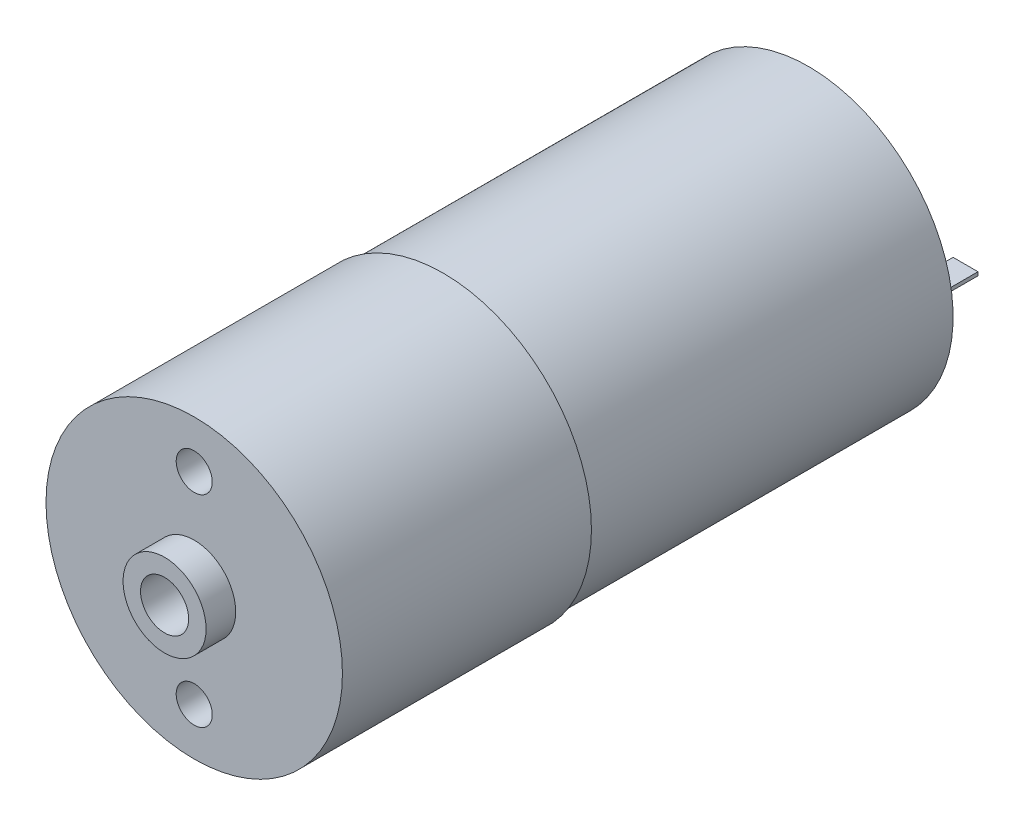
ISO-10303-21;
HEADER;
FILE_DESCRIPTION(('STEP AP214'),'2;1');
FILE_NAME('part.step','',(''),(''),'','','');
FILE_SCHEMA(('AUTOMOTIVE_DESIGN { 1 0 10303 214 1 1 1 1 }'));
ENDSEC;
DATA;
#1=APPLICATION_CONTEXT('core data for automotive mechanical design processes');
#2=APPLICATION_PROTOCOL_DEFINITION('international standard','automotive_design',2000,#1);
#3=PRODUCT_CONTEXT('',#1,'mechanical');
#4=PRODUCT('Part','Part','',(#3));
#5=PRODUCT_RELATED_PRODUCT_CATEGORY('part','',(#4));
#6=PRODUCT_DEFINITION_FORMATION('','',#4);
#7=PRODUCT_DEFINITION_CONTEXT('part definition',#1,'design');
#8=PRODUCT_DEFINITION('design','',#6,#7);
#9=PRODUCT_DEFINITION_SHAPE('','',#8);
#10=(LENGTH_UNIT() NAMED_UNIT(*) SI_UNIT(.MILLI.,.METRE.));
#11=(NAMED_UNIT(*) PLANE_ANGLE_UNIT() SI_UNIT($,.RADIAN.));
#12=(NAMED_UNIT(*) SI_UNIT($,.STERADIAN.) SOLID_ANGLE_UNIT());
#13=UNCERTAINTY_MEASURE_WITH_UNIT(LENGTH_MEASURE(1.E-05),#10,'distance_accuracy_value','');
#14=(GEOMETRIC_REPRESENTATION_CONTEXT(3) GLOBAL_UNCERTAINTY_ASSIGNED_CONTEXT((#13)) GLOBAL_UNIT_ASSIGNED_CONTEXT((#10,
#11,#12)) REPRESENTATION_CONTEXT('',''));
#15=CARTESIAN_POINT('',(0.,0.,0.));
#16=DIRECTION('',(0.,0.,1.));
#17=DIRECTION('',(1.,0.,0.));
#18=AXIS2_PLACEMENT_3D('',#15,#16,#17);
#19=CARTESIAN_POINT('',(0.,0.,-51.8));
#20=DIRECTION('',(0.,0.,1.));
#21=DIRECTION('',(1.,0.,0.));
#22=AXIS2_PLACEMENT_3D('',#19,#20,#21);
#23=PLANE('',#22);
#24=DIRECTION('',(0.,-1.,0.));
#25=VECTOR('',#24,1.);
#26=CARTESIAN_POINT('',(-10.1,0.15,-51.8));
#27=LINE('',#26,#25);
#28=CARTESIAN_POINT('',(-10.1,0.15,-51.8));
#29=VERTEX_POINT('',#28);
#30=CARTESIAN_POINT('',(-10.1,-0.15,-51.8));
#31=VERTEX_POINT('',#30);
#32=EDGE_CURVE('E139',#29,#31,#27,.T.);
#33=ORIENTED_EDGE('',*,*,#32,.T.);
#34=DIRECTION('',(1.,0.,0.));
#35=VECTOR('',#34,1.);
#36=CARTESIAN_POINT('',(-10.1,-0.15,-51.8));
#37=LINE('',#36,#35);
#38=CARTESIAN_POINT('',(-8.,-0.15,-51.8));
#39=VERTEX_POINT('',#38);
#40=EDGE_CURVE('E145',#31,#39,#37,.T.);
#41=ORIENTED_EDGE('',*,*,#40,.T.);
#42=DIRECTION('',(0.,1.,0.));
#43=VECTOR('',#42,1.);
#44=CARTESIAN_POINT('',(-8.,-0.15,-51.8));
#45=LINE('',#44,#43);
#46=CARTESIAN_POINT('',(-8.,0.15,-51.8));
#47=VERTEX_POINT('',#46);
#48=EDGE_CURVE('E143',#39,#47,#45,.T.);
#49=ORIENTED_EDGE('',*,*,#48,.T.);
#50=DIRECTION('',(-1.,0.,0.));
#51=VECTOR('',#50,1.);
#52=CARTESIAN_POINT('',(-8.,0.15,-51.8));
#53=LINE('',#52,#51);
#54=EDGE_CURVE('E150',#47,#29,#53,.T.);
#55=ORIENTED_EDGE('',*,*,#54,.T.);
#56=EDGE_LOOP('',(#33,#41,#49,#55));
#57=FACE_BOUND('',#56,.T.);
#58=CARTESIAN_POINT('',(0.,0.,-51.8));
#59=DIRECTION('',(0.,0.,1.));
#60=DIRECTION('',(1.,0.,0.));
#61=AXIS2_PLACEMENT_3D('',#58,#59,#60);
#62=CIRCLE('',#61,3.2);
#63=CARTESIAN_POINT('',(3.2,0.,-51.8));
#64=VERTEX_POINT('',#63);
#65=EDGE_CURVE('E169',#64,#64,#62,.T.);
#66=ORIENTED_EDGE('',*,*,#65,.T.);
#67=EDGE_LOOP('',(#66));
#68=FACE_BOUND('',#67,.T.);
#69=CARTESIAN_POINT('',(0.,0.,-51.8));
#70=DIRECTION('',(0.,0.,1.));
#71=DIRECTION('',(1.,0.,0.));
#72=AXIS2_PLACEMENT_3D('',#69,#70,#71);
#73=CIRCLE('',#72,12.2);
#74=CARTESIAN_POINT('',(-12.2,0.,-51.8));
#75=VERTEX_POINT('',#74);
#76=EDGE_CURVE('E175',#75,#75,#73,.T.);
#77=ORIENTED_EDGE('',*,*,#76,.F.);
#78=EDGE_LOOP('',(#77));
#79=FACE_BOUND('',#78,.T.);
#80=DIRECTION('',(0.,-1.,0.));
#81=VECTOR('',#80,1.);
#82=CARTESIAN_POINT('',(8.,0.15,-51.8));
#83=LINE('',#82,#81);
#84=CARTESIAN_POINT('',(8.,0.15,-51.8));
#85=VERTEX_POINT('',#84);
#86=CARTESIAN_POINT('',(8.,-0.15,-51.8));
#87=VERTEX_POINT('',#86);
#88=EDGE_CURVE('E57',#85,#87,#83,.T.);
#89=ORIENTED_EDGE('',*,*,#88,.T.);
#90=DIRECTION('',(1.,0.,0.));
#91=VECTOR('',#90,1.);
#92=CARTESIAN_POINT('',(8.,-0.15,-51.8));
#93=LINE('',#92,#91);
#94=CARTESIAN_POINT('',(10.1,-0.15,-51.8));
#95=VERTEX_POINT('',#94);
#96=EDGE_CURVE('E58',#87,#95,#93,.T.);
#97=ORIENTED_EDGE('',*,*,#96,.T.);
#98=DIRECTION('',(0.,1.,0.));
#99=VECTOR('',#98,1.);
#100=CARTESIAN_POINT('',(10.1,-0.15,-51.8));
#101=LINE('',#100,#99);
#102=CARTESIAN_POINT('',(10.1,0.15,-51.8));
#103=VERTEX_POINT('',#102);
#104=EDGE_CURVE('E105',#95,#103,#101,.T.);
#105=ORIENTED_EDGE('',*,*,#104,.T.);
#106=DIRECTION('',(-1.,0.,0.));
#107=VECTOR('',#106,1.);
#108=CARTESIAN_POINT('',(10.1,0.15,-51.8));
#109=LINE('',#108,#107);
#110=EDGE_CURVE('E102',#103,#85,#109,.T.);
#111=ORIENTED_EDGE('',*,*,#110,.T.);
#112=EDGE_LOOP('',(#89,#97,#105,#111));
#113=FACE_BOUND('',#112,.T.);
#114=ADVANCED_FACE('F39',(#57,#68,#79,#113),#23,.F.);
#115=CARTESIAN_POINT('',(0.,0.,0.));
#116=DIRECTION('',(0.,0.,-1.));
#117=DIRECTION('',(-1.,0.,0.));
#118=AXIS2_PLACEMENT_3D('',#115,#116,#117);
#119=CYLINDRICAL_SURFACE('',#118,12.5);
#120=CARTESIAN_POINT('',(0.,0.,0.));
#121=DIRECTION('',(0.,0.,1.));
#122=DIRECTION('',(1.,0.,0.));
#123=AXIS2_PLACEMENT_3D('',#120,#121,#122);
#124=CIRCLE('',#123,12.5);
#125=CARTESIAN_POINT('',(-12.5,0.,0.));
#126=VERTEX_POINT('',#125);
#127=EDGE_CURVE('E48',#126,#126,#124,.T.);
#128=CARTESIAN_POINT('',(0.,0.,-21.));
#129=DIRECTION('',(0.,0.,1.));
#130=DIRECTION('',(1.,0.,0.));
#131=AXIS2_PLACEMENT_3D('',#128,#129,#130);
#132=CIRCLE('',#131,12.5);
#133=CARTESIAN_POINT('',(-12.5,0.,-21.));
#134=VERTEX_POINT('',#133);
#135=EDGE_CURVE('E178',#134,#134,#132,.T.);
#136=CARTESIAN_POINT('',(-12.5,0.,0.));
#137=CARTESIAN_POINT('',(-12.5,0.,-0.21875));
#138=CARTESIAN_POINT('',(-12.5,0.,-0.4375));
#139=CARTESIAN_POINT('',(-12.5,0.,-0.875));
#140=CARTESIAN_POINT('',(-12.5,0.,-1.09375));
#141=CARTESIAN_POINT('',(-12.5,0.,-1.53125));
#142=CARTESIAN_POINT('',(-12.5,0.,-1.75));
#143=CARTESIAN_POINT('',(-12.5,0.,-2.1875));
#144=CARTESIAN_POINT('',(-12.5,0.,-2.40625));
#145=CARTESIAN_POINT('',(-12.5,0.,-2.84375));
#146=CARTESIAN_POINT('',(-12.5,0.,-3.0625));
#147=CARTESIAN_POINT('',(-12.5,0.,-3.5));
#148=CARTESIAN_POINT('',(-12.5,0.,-3.71875));
#149=CARTESIAN_POINT('',(-12.5,0.,-4.15625));
#150=CARTESIAN_POINT('',(-12.5,0.,-4.375));
#151=CARTESIAN_POINT('',(-12.5,0.,-4.8125));
#152=CARTESIAN_POINT('',(-12.5,0.,-5.03125));
#153=CARTESIAN_POINT('',(-12.5,0.,-5.46875));
#154=CARTESIAN_POINT('',(-12.5,0.,-5.6875));
#155=CARTESIAN_POINT('',(-12.5,0.,-6.125));
#156=CARTESIAN_POINT('',(-12.5,0.,-6.34375));
#157=CARTESIAN_POINT('',(-12.5,0.,-6.78125));
#158=CARTESIAN_POINT('',(-12.5,0.,-7.));
#159=CARTESIAN_POINT('',(-12.5,0.,-7.4375));
#160=CARTESIAN_POINT('',(-12.5,0.,-7.65625));
#161=CARTESIAN_POINT('',(-12.5,0.,-8.09375));
#162=CARTESIAN_POINT('',(-12.5,0.,-8.3125));
#163=CARTESIAN_POINT('',(-12.5,0.,-8.75));
#164=CARTESIAN_POINT('',(-12.5,0.,-8.96875));
#165=CARTESIAN_POINT('',(-12.5,0.,-9.40625));
#166=CARTESIAN_POINT('',(-12.5,0.,-9.625));
#167=CARTESIAN_POINT('',(-12.5,0.,-10.0625));
#168=CARTESIAN_POINT('',(-12.5,0.,-10.28125));
#169=CARTESIAN_POINT('',(-12.5,0.,-10.71875));
#170=CARTESIAN_POINT('',(-12.5,0.,-10.9375));
#171=CARTESIAN_POINT('',(-12.5,0.,-11.375));
#172=CARTESIAN_POINT('',(-12.5,0.,-11.59375));
#173=CARTESIAN_POINT('',(-12.5,0.,-12.03125));
#174=CARTESIAN_POINT('',(-12.5,0.,-12.25));
#175=CARTESIAN_POINT('',(-12.5,0.,-12.6875));
#176=CARTESIAN_POINT('',(-12.5,0.,-12.90625));
#177=CARTESIAN_POINT('',(-12.5,0.,-13.34375));
#178=CARTESIAN_POINT('',(-12.5,0.,-13.5625));
#179=CARTESIAN_POINT('',(-12.5,0.,-14.));
#180=CARTESIAN_POINT('',(-12.5,0.,-14.21875));
#181=CARTESIAN_POINT('',(-12.5,0.,-14.65625));
#182=CARTESIAN_POINT('',(-12.5,0.,-14.875));
#183=CARTESIAN_POINT('',(-12.5,0.,-15.3125));
#184=CARTESIAN_POINT('',(-12.5,0.,-15.53125));
#185=CARTESIAN_POINT('',(-12.5,0.,-15.96875));
#186=CARTESIAN_POINT('',(-12.5,0.,-16.1875));
#187=CARTESIAN_POINT('',(-12.5,0.,-16.625));
#188=CARTESIAN_POINT('',(-12.5,0.,-16.84375));
#189=CARTESIAN_POINT('',(-12.5,0.,-17.28125));
#190=CARTESIAN_POINT('',(-12.5,0.,-17.5));
#191=CARTESIAN_POINT('',(-12.5,0.,-17.9375));
#192=CARTESIAN_POINT('',(-12.5,0.,-18.15625));
#193=CARTESIAN_POINT('',(-12.5,0.,-18.59375));
#194=CARTESIAN_POINT('',(-12.5,0.,-18.8125));
#195=CARTESIAN_POINT('',(-12.5,0.,-19.25));
#196=CARTESIAN_POINT('',(-12.5,0.,-19.46875));
#197=CARTESIAN_POINT('',(-12.5,0.,-19.90625));
#198=CARTESIAN_POINT('',(-12.5,0.,-20.125));
#199=CARTESIAN_POINT('',(-12.5,0.,-20.5625));
#200=CARTESIAN_POINT('',(-12.5,0.,-20.78125));
#201=CARTESIAN_POINT('',(-12.5,0.,-21.));
#202=B_SPLINE_CURVE_WITH_KNOTS('',3,(#136,#137,#138,#139,#140,#141,#142,#143,#144,#145,#146,
#147,#148,#149,#150,#151,#152,#153,#154,#155,#156,#157,#158,#159,#160,#161,#162,#163,#164,#165,
#166,#167,#168,#169,#170,#171,#172,#173,#174,#175,#176,#177,#178,#179,#180,#181,#182,#183,#184,
#185,#186,#187,#188,#189,#190,#191,#192,#193,#194,#195,#196,#197,#198,#199,#200,#201),
.UNSPECIFIED.,.F.,.F.,(4,2,2,2,2,2,2,2,2,2,2,2,2,2,2,2,2,2,2,2,2,2,2,2,2,2,2,2,2,2,2,2,4),(0.,
0.65625,1.3125,1.96875,2.625,3.28125,3.9375,4.59375,5.25,5.90625,6.5625,7.21875,7.875,8.53125,
9.1875,9.84375,10.5,11.15625,11.8125,12.46875,13.125,13.78125,14.4375,15.09375,15.75,16.40625,
17.0625,17.71875,18.375,19.03125,19.6875,20.34375,21.),.UNSPECIFIED.);
#203=EDGE_CURVE('BSEAM41',#126,#134,#202,.T.);
#204=ORIENTED_EDGE('',*,*,#127,.F.);
#205=ORIENTED_EDGE('',*,*,#135,.T.);
#206=ORIENTED_EDGE('',*,*,#203,.T.);
#207=ORIENTED_EDGE('',*,*,#203,.F.);
#208=EDGE_LOOP('',(#204,#206,#205,#207));
#209=FACE_BOUND('',#208,.T.);
#210=ADVANCED_FACE('F41',(#209),#119,.T.);
#211=CARTESIAN_POINT('',(0.,0.,0.));
#212=DIRECTION('',(0.,0.,1.));
#213=DIRECTION('',(1.,0.,0.));
#214=AXIS2_PLACEMENT_3D('',#211,#212,#213);
#215=PLANE('',#214);
#216=CARTESIAN_POINT('',(0.,0.,0.));
#217=DIRECTION('',(0.,0.,1.));
#218=DIRECTION('',(1.,0.,0.));
#219=AXIS2_PLACEMENT_3D('',#216,#217,#218);
#220=CIRCLE('',#219,3.5);
#221=CARTESIAN_POINT('',(3.5,0.,0.));
#222=VERTEX_POINT('',#221);
#223=EDGE_CURVE('E11',#222,#222,#220,.T.);
#224=ORIENTED_EDGE('',*,*,#223,.F.);
#225=EDGE_LOOP('',(#224));
#226=FACE_BOUND('',#225,.T.);
#227=CARTESIAN_POINT('',(0.,8.5,0.));
#228=DIRECTION('',(0.,0.,1.));
#229=DIRECTION('',(1.,0.,0.));
#230=AXIS2_PLACEMENT_3D('',#227,#228,#229);
#231=CIRCLE('',#230,1.52);
#232=CARTESIAN_POINT('',(1.52,8.5,0.));
#233=VERTEX_POINT('',#232);
#234=EDGE_CURVE('E128',#233,#233,#231,.F.);
#235=ORIENTED_EDGE('',*,*,#234,.T.);
#236=EDGE_LOOP('',(#235));
#237=FACE_BOUND('',#236,.T.);
#238=CARTESIAN_POINT('',(0.,-8.5,0.));
#239=DIRECTION('',(0.,0.,1.));
#240=DIRECTION('',(1.,0.,0.));
#241=AXIS2_PLACEMENT_3D('',#238,#239,#240);
#242=CIRCLE('',#241,1.52);
#243=CARTESIAN_POINT('',(1.52,-8.5,0.));
#244=VERTEX_POINT('',#243);
#245=EDGE_CURVE('E184',#244,#244,#242,.F.);
#246=ORIENTED_EDGE('',*,*,#245,.T.);
#247=EDGE_LOOP('',(#246));
#248=FACE_BOUND('',#247,.T.);
#249=ORIENTED_EDGE('',*,*,#127,.T.);
#250=EDGE_LOOP('',(#249));
#251=FACE_BOUND('',#250,.T.);
#252=ADVANCED_FACE('F192',(#226,#237,#248,#251),#215,.T.);
#253=CARTESIAN_POINT('',(0.,0.,-21.));
#254=DIRECTION('',(0.,0.,1.));
#255=DIRECTION('',(1.,0.,0.));
#256=AXIS2_PLACEMENT_3D('',#253,#254,#255);
#257=PLANE('',#256);
#258=CARTESIAN_POINT('',(0.,0.,-21.));
#259=DIRECTION('',(0.,0.,1.));
#260=DIRECTION('',(1.,0.,0.));
#261=AXIS2_PLACEMENT_3D('',#258,#259,#260);
#262=CIRCLE('',#261,12.2);
#263=CARTESIAN_POINT('',(-12.2,0.,-21.));
#264=VERTEX_POINT('',#263);
#265=EDGE_CURVE('E174',#264,#264,#262,.T.);
#266=ORIENTED_EDGE('',*,*,#265,.T.);
#267=EDGE_LOOP('',(#266));
#268=FACE_BOUND('',#267,.T.);
#269=ORIENTED_EDGE('',*,*,#135,.F.);
#270=EDGE_LOOP('',(#269));
#271=FACE_BOUND('',#270,.T.);
#272=ADVANCED_FACE('F252',(#268,#271),#257,.F.);
#273=CARTESIAN_POINT('',(0.,0.,-21.));
#274=DIRECTION('',(0.,0.,-1.));
#275=DIRECTION('',(-1.,0.,0.));
#276=AXIS2_PLACEMENT_3D('',#273,#274,#275);
#277=CYLINDRICAL_SURFACE('',#276,12.2);
#278=CARTESIAN_POINT('',(-12.2,0.,-21.));
#279=CARTESIAN_POINT('',(-12.2,0.,-21.3208333333333));
#280=CARTESIAN_POINT('',(-12.2,0.,-21.6416666666667));
#281=CARTESIAN_POINT('',(-12.2,0.,-22.2833333333333));
#282=CARTESIAN_POINT('',(-12.2,0.,-22.6041666666667));
#283=CARTESIAN_POINT('',(-12.2,0.,-23.2458333333333));
#284=CARTESIAN_POINT('',(-12.2,0.,-23.5666666666667));
#285=CARTESIAN_POINT('',(-12.2,0.,-24.2083333333333));
#286=CARTESIAN_POINT('',(-12.2,0.,-24.5291666666667));
#287=CARTESIAN_POINT('',(-12.2,0.,-25.1708333333333));
#288=CARTESIAN_POINT('',(-12.2,0.,-25.4916666666667));
#289=CARTESIAN_POINT('',(-12.2,0.,-26.1333333333333));
#290=CARTESIAN_POINT('',(-12.2,0.,-26.4541666666667));
#291=CARTESIAN_POINT('',(-12.2,0.,-27.0958333333333));
#292=CARTESIAN_POINT('',(-12.2,0.,-27.4166666666667));
#293=CARTESIAN_POINT('',(-12.2,0.,-28.0583333333333));
#294=CARTESIAN_POINT('',(-12.2,0.,-28.3791666666667));
#295=CARTESIAN_POINT('',(-12.2,0.,-29.0208333333333));
#296=CARTESIAN_POINT('',(-12.2,0.,-29.3416666666667));
#297=CARTESIAN_POINT('',(-12.2,0.,-29.9833333333333));
#298=CARTESIAN_POINT('',(-12.2,0.,-30.3041666666667));
#299=CARTESIAN_POINT('',(-12.2,0.,-30.9458333333333));
#300=CARTESIAN_POINT('',(-12.2,0.,-31.2666666666667));
#301=CARTESIAN_POINT('',(-12.2,0.,-31.9083333333333));
#302=CARTESIAN_POINT('',(-12.2,0.,-32.2291666666667));
#303=CARTESIAN_POINT('',(-12.2,0.,-32.8708333333333));
#304=CARTESIAN_POINT('',(-12.2,0.,-33.1916666666667));
#305=CARTESIAN_POINT('',(-12.2,0.,-33.8333333333333));
#306=CARTESIAN_POINT('',(-12.2,0.,-34.1541666666667));
#307=CARTESIAN_POINT('',(-12.2,0.,-34.7958333333333));
#308=CARTESIAN_POINT('',(-12.2,0.,-35.1166666666667));
#309=CARTESIAN_POINT('',(-12.2,0.,-35.7583333333333));
#310=CARTESIAN_POINT('',(-12.2,0.,-36.0791666666667));
#311=CARTESIAN_POINT('',(-12.2,0.,-36.7208333333333));
#312=CARTESIAN_POINT('',(-12.2,0.,-37.0416666666667));
#313=CARTESIAN_POINT('',(-12.2,0.,-37.6833333333333));
#314=CARTESIAN_POINT('',(-12.2,0.,-38.0041666666667));
#315=CARTESIAN_POINT('',(-12.2,0.,-38.6458333333333));
#316=CARTESIAN_POINT('',(-12.2,0.,-38.9666666666667));
#317=CARTESIAN_POINT('',(-12.2,0.,-39.6083333333333));
#318=CARTESIAN_POINT('',(-12.2,0.,-39.9291666666667));
#319=CARTESIAN_POINT('',(-12.2,0.,-40.5708333333333));
#320=CARTESIAN_POINT('',(-12.2,0.,-40.8916666666667));
#321=CARTESIAN_POINT('',(-12.2,0.,-41.5333333333333));
#322=CARTESIAN_POINT('',(-12.2,0.,-41.8541666666667));
#323=CARTESIAN_POINT('',(-12.2,0.,-42.4958333333333));
#324=CARTESIAN_POINT('',(-12.2,0.,-42.8166666666667));
#325=CARTESIAN_POINT('',(-12.2,0.,-43.4583333333333));
#326=CARTESIAN_POINT('',(-12.2,0.,-43.7791666666667));
#327=CARTESIAN_POINT('',(-12.2,0.,-44.4208333333333));
#328=CARTESIAN_POINT('',(-12.2,0.,-44.7416666666667));
#329=CARTESIAN_POINT('',(-12.2,0.,-45.3833333333333));
#330=CARTESIAN_POINT('',(-12.2,0.,-45.7041666666667));
#331=CARTESIAN_POINT('',(-12.2,0.,-46.3458333333333));
#332=CARTESIAN_POINT('',(-12.2,0.,-46.6666666666667));
#333=CARTESIAN_POINT('',(-12.2,0.,-47.3083333333333));
#334=CARTESIAN_POINT('',(-12.2,0.,-47.6291666666667));
#335=CARTESIAN_POINT('',(-12.2,0.,-48.2708333333333));
#336=CARTESIAN_POINT('',(-12.2,0.,-48.5916666666667));
#337=CARTESIAN_POINT('',(-12.2,0.,-49.2333333333333));
#338=CARTESIAN_POINT('',(-12.2,0.,-49.5541666666667));
#339=CARTESIAN_POINT('',(-12.2,0.,-50.1958333333333));
#340=CARTESIAN_POINT('',(-12.2,0.,-50.5166666666667));
#341=CARTESIAN_POINT('',(-12.2,0.,-51.1583333333333));
#342=CARTESIAN_POINT('',(-12.2,0.,-51.4791666666667));
#343=CARTESIAN_POINT('',(-12.2,0.,-51.8));
#344=B_SPLINE_CURVE_WITH_KNOTS('',3,(#278,#279,#280,#281,#282,#283,#284,#285,#286,#287,#288,
#289,#290,#291,#292,#293,#294,#295,#296,#297,#298,#299,#300,#301,#302,#303,#304,#305,#306,#307,
#308,#309,#310,#311,#312,#313,#314,#315,#316,#317,#318,#319,#320,#321,#322,#323,#324,#325,#326,
#327,#328,#329,#330,#331,#332,#333,#334,#335,#336,#337,#338,#339,#340,#341,#342,#343),
.UNSPECIFIED.,.F.,.F.,(4,2,2,2,2,2,2,2,2,2,2,2,2,2,2,2,2,2,2,2,2,2,2,2,2,2,2,2,2,2,2,2,4),(0.,
0.962500000000002,1.925,2.8875,3.85,4.8125,5.775,6.7375,7.7,8.6625,9.625,10.5875,11.55,12.5125,
13.475,14.4375,15.4,16.3625,17.325,18.2875,19.25,20.2125,21.175,22.1375,23.1,24.0625,25.025,
25.9875,26.95,27.9125,28.875,29.8375,30.8),.UNSPECIFIED.);
#345=EDGE_CURVE('BSEAM247',#264,#75,#344,.T.);
#346=ORIENTED_EDGE('',*,*,#265,.F.);
#347=ORIENTED_EDGE('',*,*,#76,.T.);
#348=ORIENTED_EDGE('',*,*,#345,.T.);
#349=ORIENTED_EDGE('',*,*,#345,.F.);
#350=EDGE_LOOP('',(#346,#348,#347,#349));
#351=FACE_BOUND('',#350,.T.);
#352=ADVANCED_FACE('F247',(#351),#277,.T.);
#353=CARTESIAN_POINT('',(0.,0.,-51.8));
#354=DIRECTION('',(0.,0.,-1.));
#355=DIRECTION('',(-1.,0.,0.));
#356=AXIS2_PLACEMENT_3D('',#353,#354,#355);
#357=CYLINDRICAL_SURFACE('',#356,3.2);
#358=ORIENTED_EDGE('',*,*,#65,.F.);
#359=EDGE_LOOP('',(#358));
#360=FACE_BOUND('',#359,.T.);
#361=CARTESIAN_POINT('',(0.,0.,-53.3));
#362=DIRECTION('',(0.,0.,1.));
#363=DIRECTION('',(1.,0.,0.));
#364=AXIS2_PLACEMENT_3D('',#361,#362,#363);
#365=CIRCLE('',#364,3.2);
#366=CARTESIAN_POINT('',(3.2,0.,-53.3));
#367=VERTEX_POINT('',#366);
#368=EDGE_CURVE('E166',#367,#367,#365,.T.);
#369=ORIENTED_EDGE('',*,*,#368,.T.);
#370=EDGE_LOOP('',(#369));
#371=FACE_BOUND('',#370,.T.);
#372=ADVANCED_FACE('F246',(#360,#371),#357,.T.);
#373=CARTESIAN_POINT('',(0.,0.,-53.3));
#374=DIRECTION('',(0.,0.,1.));
#375=DIRECTION('',(1.,0.,0.));
#376=AXIS2_PLACEMENT_3D('',#373,#374,#375);
#377=PLANE('',#376);
#378=ORIENTED_EDGE('',*,*,#368,.F.);
#379=EDGE_LOOP('',(#378));
#380=FACE_BOUND('',#379,.T.);
#381=ADVANCED_FACE('F284',(#380),#377,.F.);
#382=CARTESIAN_POINT('',(-10.1,0.15,-51.8));
#383=DIRECTION('',(1.,0.,0.));
#384=DIRECTION('',(0.,1.,0.));
#385=AXIS2_PLACEMENT_3D('',#382,#383,#384);
#386=PLANE('',#385);
#387=DIRECTION('',(0.,-1.,0.));
#388=VECTOR('',#387,1.);
#389=CARTESIAN_POINT('',(-10.1,0.15,-56.));
#390=LINE('',#389,#388);
#391=CARTESIAN_POINT('',(-10.1,0.15,-56.));
#392=VERTEX_POINT('',#391);
#393=CARTESIAN_POINT('',(-10.1,-0.15,-56.));
#394=VERTEX_POINT('',#393);
#395=EDGE_CURVE('E138',#392,#394,#390,.T.);
#396=ORIENTED_EDGE('',*,*,#395,.T.);
#397=DIRECTION('',(0.,0.,-1.));
#398=VECTOR('',#397,1.);
#399=CARTESIAN_POINT('',(-10.1,-0.15,-51.8));
#400=LINE('',#399,#398);
#401=EDGE_CURVE('E164',#31,#394,#400,.T.);
#402=ORIENTED_EDGE('',*,*,#401,.F.);
#403=ORIENTED_EDGE('',*,*,#32,.F.);
#404=DIRECTION('',(0.,0.,-1.));
#405=VECTOR('',#404,1.);
#406=CARTESIAN_POINT('',(-10.1,0.15,-51.8));
#407=LINE('',#406,#405);
#408=EDGE_CURVE('E146',#29,#392,#407,.T.);
#409=ORIENTED_EDGE('',*,*,#408,.T.);
#410=EDGE_LOOP('',(#396,#402,#403,#409));
#411=FACE_BOUND('',#410,.T.);
#412=ADVANCED_FACE('F288',(#411),#386,.F.);
#413=CARTESIAN_POINT('',(-10.1,-0.15,-51.8));
#414=DIRECTION('',(0.,1.,0.));
#415=DIRECTION('',(0.,0.,1.));
#416=AXIS2_PLACEMENT_3D('',#413,#414,#415);
#417=PLANE('',#416);
#418=DIRECTION('',(1.,0.,0.));
#419=VECTOR('',#418,1.);
#420=CARTESIAN_POINT('',(-10.1,-0.15,-56.));
#421=LINE('',#420,#419);
#422=CARTESIAN_POINT('',(-8.,-0.15,-56.));
#423=VERTEX_POINT('',#422);
#424=EDGE_CURVE('E151',#394,#423,#421,.T.);
#425=ORIENTED_EDGE('',*,*,#424,.T.);
#426=DIRECTION('',(0.,0.,-1.));
#427=VECTOR('',#426,1.);
#428=CARTESIAN_POINT('',(-8.,-0.15,-51.8));
#429=LINE('',#428,#427);
#430=EDGE_CURVE('E162',#39,#423,#429,.T.);
#431=ORIENTED_EDGE('',*,*,#430,.F.);
#432=ORIENTED_EDGE('',*,*,#40,.F.);
#433=ORIENTED_EDGE('',*,*,#401,.T.);
#434=EDGE_LOOP('',(#425,#431,#432,#433));
#435=FACE_BOUND('',#434,.T.);
#436=ADVANCED_FACE('F300',(#435),#417,.F.);
#437=CARTESIAN_POINT('',(-8.,-0.15,-51.8));
#438=DIRECTION('',(-1.,0.,0.));
#439=DIRECTION('',(0.,0.,1.));
#440=AXIS2_PLACEMENT_3D('',#437,#438,#439);
#441=PLANE('',#440);
#442=DIRECTION('',(0.,1.,0.));
#443=VECTOR('',#442,1.);
#444=CARTESIAN_POINT('',(-8.,-0.15,-56.));
#445=LINE('',#444,#443);
#446=CARTESIAN_POINT('',(-8.,0.15,-56.));
#447=VERTEX_POINT('',#446);
#448=EDGE_CURVE('E153',#423,#447,#445,.T.);
#449=ORIENTED_EDGE('',*,*,#448,.T.);
#450=DIRECTION('',(0.,0.,-1.));
#451=VECTOR('',#450,1.);
#452=CARTESIAN_POINT('',(-8.,0.15,-51.8));
#453=LINE('',#452,#451);
#454=EDGE_CURVE('E158',#47,#447,#453,.T.);
#455=ORIENTED_EDGE('',*,*,#454,.F.);
#456=ORIENTED_EDGE('',*,*,#48,.F.);
#457=ORIENTED_EDGE('',*,*,#430,.T.);
#458=EDGE_LOOP('',(#449,#455,#456,#457));
#459=FACE_BOUND('',#458,.T.);
#460=ADVANCED_FACE('F306',(#459),#441,.F.);
#461=CARTESIAN_POINT('',(-8.,0.15,-51.8));
#462=DIRECTION('',(0.,-1.,0.));
#463=DIRECTION('',(0.,0.,-1.));
#464=AXIS2_PLACEMENT_3D('',#461,#462,#463);
#465=PLANE('',#464);
#466=DIRECTION('',(-1.,0.,0.));
#467=VECTOR('',#466,1.);
#468=CARTESIAN_POINT('',(-8.,0.15,-56.));
#469=LINE('',#468,#467);
#470=EDGE_CURVE('E141',#447,#392,#469,.T.);
#471=ORIENTED_EDGE('',*,*,#470,.T.);
#472=ORIENTED_EDGE('',*,*,#408,.F.);
#473=ORIENTED_EDGE('',*,*,#54,.F.);
#474=ORIENTED_EDGE('',*,*,#454,.T.);
#475=EDGE_LOOP('',(#471,#472,#473,#474));
#476=FACE_BOUND('',#475,.T.);
#477=ADVANCED_FACE('F314',(#476),#465,.F.);
#478=CARTESIAN_POINT('',(0.,0.,-56.));
#479=DIRECTION('',(0.,0.,1.));
#480=DIRECTION('',(1.,0.,0.));
#481=AXIS2_PLACEMENT_3D('',#478,#479,#480);
#482=PLANE('',#481);
#483=ORIENTED_EDGE('',*,*,#395,.F.);
#484=ORIENTED_EDGE('',*,*,#470,.F.);
#485=ORIENTED_EDGE('',*,*,#448,.F.);
#486=ORIENTED_EDGE('',*,*,#424,.F.);
#487=EDGE_LOOP('',(#483,#484,#485,#486));
#488=FACE_BOUND('',#487,.T.);
#489=ADVANCED_FACE('F324',(#488),#482,.F.);
#490=CARTESIAN_POINT('',(8.,0.15,-51.8));
#491=DIRECTION('',(1.,0.,0.));
#492=DIRECTION('',(0.,0.,-1.));
#493=AXIS2_PLACEMENT_3D('',#490,#491,#492);
#494=PLANE('',#493);
#495=DIRECTION('',(0.,-1.,0.));
#496=VECTOR('',#495,1.);
#497=CARTESIAN_POINT('',(8.,0.15,-56.));
#498=LINE('',#497,#496);
#499=CARTESIAN_POINT('',(8.,0.15,-56.));
#500=VERTEX_POINT('',#499);
#501=CARTESIAN_POINT('',(8.,-0.15,-56.));
#502=VERTEX_POINT('',#501);
#503=EDGE_CURVE('E127',#500,#502,#498,.T.);
#504=ORIENTED_EDGE('',*,*,#503,.T.);
#505=DIRECTION('',(0.,0.,-1.));
#506=VECTOR('',#505,1.);
#507=CARTESIAN_POINT('',(8.,-0.15,-51.8));
#508=LINE('',#507,#506);
#509=EDGE_CURVE('E136',#87,#502,#508,.T.);
#510=ORIENTED_EDGE('',*,*,#509,.F.);
#511=ORIENTED_EDGE('',*,*,#88,.F.);
#512=DIRECTION('',(0.,0.,-1.));
#513=VECTOR('',#512,1.);
#514=CARTESIAN_POINT('',(8.,0.15,-51.8));
#515=LINE('',#514,#513);
#516=EDGE_CURVE('E117',#85,#500,#515,.T.);
#517=ORIENTED_EDGE('',*,*,#516,.T.);
#518=EDGE_LOOP('',(#504,#510,#511,#517));
#519=FACE_BOUND('',#518,.T.);
#520=ADVANCED_FACE('F331',(#519),#494,.F.);
#521=CARTESIAN_POINT('',(8.,-0.15,-51.8));
#522=DIRECTION('',(0.,1.,0.));
#523=DIRECTION('',(0.,0.,1.));
#524=AXIS2_PLACEMENT_3D('',#521,#522,#523);
#525=PLANE('',#524);
#526=DIRECTION('',(1.,0.,0.));
#527=VECTOR('',#526,1.);
#528=CARTESIAN_POINT('',(8.,-0.15,-56.));
#529=LINE('',#528,#527);
#530=CARTESIAN_POINT('',(10.1,-0.15,-56.));
#531=VERTEX_POINT('',#530);
#532=EDGE_CURVE('E126',#502,#531,#529,.T.);
#533=ORIENTED_EDGE('',*,*,#532,.T.);
#534=DIRECTION('',(0.,0.,-1.));
#535=VECTOR('',#534,1.);
#536=CARTESIAN_POINT('',(10.1,-0.15,-51.8));
#537=LINE('',#536,#535);
#538=EDGE_CURVE('E120',#95,#531,#537,.T.);
#539=ORIENTED_EDGE('',*,*,#538,.F.);
#540=ORIENTED_EDGE('',*,*,#96,.F.);
#541=ORIENTED_EDGE('',*,*,#509,.T.);
#542=EDGE_LOOP('',(#533,#539,#540,#541));
#543=FACE_BOUND('',#542,.T.);
#544=ADVANCED_FACE('F346',(#543),#525,.F.);
#545=CARTESIAN_POINT('',(10.1,-0.15,-51.8));
#546=DIRECTION('',(-1.,0.,0.));
#547=DIRECTION('',(0.,0.,1.));
#548=AXIS2_PLACEMENT_3D('',#545,#546,#547);
#549=PLANE('',#548);
#550=DIRECTION('',(0.,1.,0.));
#551=VECTOR('',#550,1.);
#552=CARTESIAN_POINT('',(10.1,-0.15,-56.));
#553=LINE('',#552,#551);
#554=CARTESIAN_POINT('',(10.1,0.15,-56.));
#555=VERTEX_POINT('',#554);
#556=EDGE_CURVE('E112',#531,#555,#553,.T.);
#557=ORIENTED_EDGE('',*,*,#556,.T.);
#558=DIRECTION('',(0.,0.,-1.));
#559=VECTOR('',#558,1.);
#560=CARTESIAN_POINT('',(10.1,0.15,-51.8));
#561=LINE('',#560,#559);
#562=EDGE_CURVE('E111',#103,#555,#561,.T.);
#563=ORIENTED_EDGE('',*,*,#562,.F.);
#564=ORIENTED_EDGE('',*,*,#104,.F.);
#565=ORIENTED_EDGE('',*,*,#538,.T.);
#566=EDGE_LOOP('',(#557,#563,#564,#565));
#567=FACE_BOUND('',#566,.T.);
#568=ADVANCED_FACE('F115',(#567),#549,.F.);
#569=CARTESIAN_POINT('',(10.1,0.15,-51.8));
#570=DIRECTION('',(0.,-1.,0.));
#571=DIRECTION('',(0.,0.,-1.));
#572=AXIS2_PLACEMENT_3D('',#569,#570,#571);
#573=PLANE('',#572);
#574=DIRECTION('',(-1.,0.,0.));
#575=VECTOR('',#574,1.);
#576=CARTESIAN_POINT('',(10.1,0.15,-56.));
#577=LINE('',#576,#575);
#578=EDGE_CURVE('E135',#555,#500,#577,.T.);
#579=ORIENTED_EDGE('',*,*,#578,.T.);
#580=ORIENTED_EDGE('',*,*,#516,.F.);
#581=ORIENTED_EDGE('',*,*,#110,.F.);
#582=ORIENTED_EDGE('',*,*,#562,.T.);
#583=EDGE_LOOP('',(#579,#580,#581,#582));
#584=FACE_BOUND('',#583,.T.);
#585=ADVANCED_FACE('F119',(#584),#573,.F.);
#586=CARTESIAN_POINT('',(0.,0.,-56.));
#587=DIRECTION('',(0.,0.,1.));
#588=DIRECTION('',(1.,0.,0.));
#589=AXIS2_PLACEMENT_3D('',#586,#587,#588);
#590=PLANE('',#589);
#591=ORIENTED_EDGE('',*,*,#503,.F.);
#592=ORIENTED_EDGE('',*,*,#578,.F.);
#593=ORIENTED_EDGE('',*,*,#556,.F.);
#594=ORIENTED_EDGE('',*,*,#532,.F.);
#595=EDGE_LOOP('',(#591,#592,#593,#594));
#596=FACE_BOUND('',#595,.T.);
#597=ADVANCED_FACE('F372',(#596),#590,.F.);
#598=CARTESIAN_POINT('',(0.,-8.5,0.0999999999999994));
#599=DIRECTION('',(0.,0.,-1.));
#600=DIRECTION('',(-1.,0.,0.));
#601=AXIS2_PLACEMENT_3D('',#598,#599,#600);
#602=CYLINDRICAL_SURFACE('',#601,1.52);
#603=ORIENTED_EDGE('',*,*,#245,.F.);
#604=EDGE_LOOP('',(#603));
#605=FACE_BOUND('',#604,.T.);
#606=CARTESIAN_POINT('',(0.,-8.5,-6.));
#607=DIRECTION('',(0.,0.,1.));
#608=DIRECTION('',(1.,0.,0.));
#609=AXIS2_PLACEMENT_3D('',#606,#607,#608);
#610=CIRCLE('',#609,1.52);
#611=CARTESIAN_POINT('',(1.52,-8.5,-6.));
#612=VERTEX_POINT('',#611);
#613=EDGE_CURVE('E202',#612,#612,#610,.T.);
#614=ORIENTED_EDGE('',*,*,#613,.F.);
#615=EDGE_LOOP('',(#614));
#616=FACE_BOUND('',#615,.T.);
#617=ADVANCED_FACE('F384',(#605,#616),#602,.F.);
#618=CARTESIAN_POINT('',(0.,-8.5,-6.));
#619=DIRECTION('',(0.,0.,1.));
#620=DIRECTION('',(1.,0.,0.));
#621=AXIS2_PLACEMENT_3D('',#618,#619,#620);
#622=PLANE('',#621);
#623=ORIENTED_EDGE('',*,*,#613,.T.);
#624=EDGE_LOOP('',(#623));
#625=FACE_BOUND('',#624,.T.);
#626=ADVANCED_FACE('F200',(#625),#622,.T.);
#627=CARTESIAN_POINT('',(0.,8.5,0.0999999999999994));
#628=DIRECTION('',(0.,0.,-1.));
#629=DIRECTION('',(-1.,0.,0.));
#630=AXIS2_PLACEMENT_3D('',#627,#628,#629);
#631=CYLINDRICAL_SURFACE('',#630,1.52);
#632=ORIENTED_EDGE('',*,*,#234,.F.);
#633=EDGE_LOOP('',(#632));
#634=FACE_BOUND('',#633,.T.);
#635=CARTESIAN_POINT('',(0.,8.5,-6.));
#636=DIRECTION('',(0.,0.,1.));
#637=DIRECTION('',(1.,0.,0.));
#638=AXIS2_PLACEMENT_3D('',#635,#636,#637);
#639=CIRCLE('',#638,1.52);
#640=CARTESIAN_POINT('',(1.52,8.5,-6.));
#641=VERTEX_POINT('',#640);
#642=EDGE_CURVE('E190',#641,#641,#639,.T.);
#643=ORIENTED_EDGE('',*,*,#642,.F.);
#644=EDGE_LOOP('',(#643));
#645=FACE_BOUND('',#644,.T.);
#646=ADVANCED_FACE('F191',(#634,#645),#631,.F.);
#647=CARTESIAN_POINT('',(0.,8.5,-6.));
#648=DIRECTION('',(0.,0.,1.));
#649=DIRECTION('',(1.,0.,0.));
#650=AXIS2_PLACEMENT_3D('',#647,#648,#649);
#651=PLANE('',#650);
#652=ORIENTED_EDGE('',*,*,#642,.T.);
#653=EDGE_LOOP('',(#652));
#654=FACE_BOUND('',#653,.T.);
#655=ADVANCED_FACE('F196',(#654),#651,.T.);
#656=CARTESIAN_POINT('',(0.,0.,2.5));
#657=DIRECTION('',(0.,0.,-1.));
#658=DIRECTION('',(-1.,0.,0.));
#659=AXIS2_PLACEMENT_3D('',#656,#657,#658);
#660=CYLINDRICAL_SURFACE('',#659,3.5);
#661=CARTESIAN_POINT('',(0.,0.,2.5));
#662=DIRECTION('',(0.,0.,1.));
#663=DIRECTION('',(1.,0.,0.));
#664=AXIS2_PLACEMENT_3D('',#661,#662,#663);
#665=CIRCLE('',#664,3.5);
#666=CARTESIAN_POINT('',(3.5,0.,2.5));
#667=VERTEX_POINT('',#666);
#668=EDGE_CURVE('E207',#667,#667,#665,.T.);
#669=ORIENTED_EDGE('',*,*,#668,.F.);
#670=EDGE_LOOP('',(#669));
#671=FACE_BOUND('',#670,.T.);
#672=ORIENTED_EDGE('',*,*,#223,.T.);
#673=EDGE_LOOP('',(#672));
#674=FACE_BOUND('',#673,.T.);
#675=ADVANCED_FACE('F235',(#671,#674),#660,.T.);
#676=CARTESIAN_POINT('',(0.,0.,2.5));
#677=DIRECTION('',(0.,0.,1.));
#678=DIRECTION('',(1.,0.,0.));
#679=AXIS2_PLACEMENT_3D('',#676,#677,#678);
#680=PLANE('',#679);
#681=CARTESIAN_POINT('',(0.,0.,2.5));
#682=DIRECTION('',(0.,0.,1.));
#683=DIRECTION('',(1.,0.,0.));
#684=AXIS2_PLACEMENT_3D('',#681,#682,#683);
#685=CIRCLE('',#684,2.03);
#686=CARTESIAN_POINT('',(2.03,0.,2.5));
#687=VERTEX_POINT('',#686);
#688=EDGE_CURVE('E43',#687,#687,#685,.F.);
#689=ORIENTED_EDGE('',*,*,#688,.T.);
#690=EDGE_LOOP('',(#689));
#691=FACE_BOUND('',#690,.T.);
#692=ORIENTED_EDGE('',*,*,#668,.T.);
#693=EDGE_LOOP('',(#692));
#694=FACE_BOUND('',#693,.T.);
#695=ADVANCED_FACE('F218',(#691,#694),#680,.T.);
#696=CARTESIAN_POINT('',(0.,0.,2.6));
#697=DIRECTION('',(0.,0.,-1.));
#698=DIRECTION('',(-1.,0.,0.));
#699=AXIS2_PLACEMENT_3D('',#696,#697,#698);
#700=CYLINDRICAL_SURFACE('',#699,2.03);
#701=ORIENTED_EDGE('',*,*,#688,.F.);
#702=EDGE_LOOP('',(#701));
#703=FACE_BOUND('',#702,.T.);
#704=CARTESIAN_POINT('',(0.,0.,-1.));
#705=DIRECTION('',(0.,0.,1.));
#706=DIRECTION('',(1.,0.,0.));
#707=AXIS2_PLACEMENT_3D('',#704,#705,#706);
#708=CIRCLE('',#707,2.03);
#709=CARTESIAN_POINT('',(2.03,0.,-1.));
#710=VERTEX_POINT('',#709);
#711=EDGE_CURVE('E215',#710,#710,#708,.T.);
#712=ORIENTED_EDGE('',*,*,#711,.F.);
#713=EDGE_LOOP('',(#712));
#714=FACE_BOUND('',#713,.T.);
#715=ADVANCED_FACE('F225',(#703,#714),#700,.F.);
#716=CARTESIAN_POINT('',(0.,0.,-1.));
#717=DIRECTION('',(0.,0.,1.));
#718=DIRECTION('',(1.,0.,0.));
#719=AXIS2_PLACEMENT_3D('',#716,#717,#718);
#720=PLANE('',#719);
#721=ORIENTED_EDGE('',*,*,#711,.T.);
#722=EDGE_LOOP('',(#721));
#723=FACE_BOUND('',#722,.T.);
#724=ADVANCED_FACE('F224',(#723),#720,.T.);
#725=CLOSED_SHELL('',(#114,#210,#252,#272,#352,#372,#381,#412,#436,#460,#477,#489,#520,#544,
#568,#585,#597,#617,#626,#646,#655,#675,#695,#715,#724));
#726=MANIFOLD_SOLID_BREP('B2',#725);
#727=ADVANCED_BREP_SHAPE_REPRESENTATION('',(#18,#726),#14);
#728=SHAPE_DEFINITION_REPRESENTATION(#9,#727);
ENDSEC;
END-ISO-10303-21;
